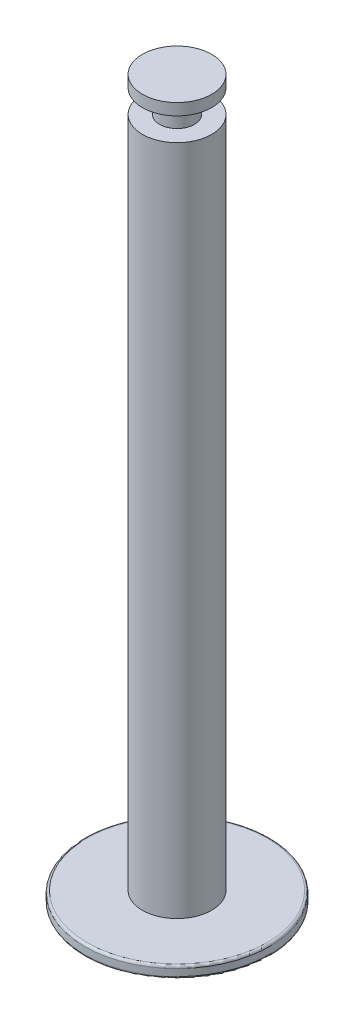
ISO-10303-21;
HEADER;
FILE_DESCRIPTION(('STEP AP214'),'2;1');
FILE_NAME('part.step','',(''),(''),'','','');
FILE_SCHEMA(('AUTOMOTIVE_DESIGN { 1 0 10303 214 1 1 1 1 }'));
ENDSEC;
DATA;
#1=APPLICATION_CONTEXT('core data for automotive mechanical design processes');
#2=APPLICATION_PROTOCOL_DEFINITION('international standard','automotive_design',2000,#1);
#3=PRODUCT_CONTEXT('',#1,'mechanical');
#4=PRODUCT('Part','Part','',(#3));
#5=PRODUCT_RELATED_PRODUCT_CATEGORY('part','',(#4));
#6=PRODUCT_DEFINITION_FORMATION('','',#4);
#7=PRODUCT_DEFINITION_CONTEXT('part definition',#1,'design');
#8=PRODUCT_DEFINITION('design','',#6,#7);
#9=PRODUCT_DEFINITION_SHAPE('','',#8);
#10=(LENGTH_UNIT() NAMED_UNIT(*) SI_UNIT(.MILLI.,.METRE.));
#11=(NAMED_UNIT(*) PLANE_ANGLE_UNIT() SI_UNIT($,.RADIAN.));
#12=(NAMED_UNIT(*) SI_UNIT($,.STERADIAN.) SOLID_ANGLE_UNIT());
#13=UNCERTAINTY_MEASURE_WITH_UNIT(LENGTH_MEASURE(1.E-05),#10,'distance_accuracy_value','');
#14=(GEOMETRIC_REPRESENTATION_CONTEXT(3) GLOBAL_UNCERTAINTY_ASSIGNED_CONTEXT((#13)) GLOBAL_UNIT_ASSIGNED_CONTEXT((#10,
#11,#12)) REPRESENTATION_CONTEXT('',''));
#15=CARTESIAN_POINT('',(0.,0.,0.));
#16=DIRECTION('',(0.,0.,1.));
#17=DIRECTION('',(1.,0.,0.));
#18=AXIS2_PLACEMENT_3D('',#15,#16,#17);
#19=CARTESIAN_POINT('',(0.,1.,0.));
#20=DIRECTION('',(0.,-1.,0.));
#21=DIRECTION('',(0.,0.,-1.));
#22=AXIS2_PLACEMENT_3D('',#19,#20,#21);
#23=CYLINDRICAL_SURFACE('',#22,7.99);
#24=CARTESIAN_POINT('',(0.,0.2,0.));
#25=DIRECTION('',(0.,1.,0.));
#26=DIRECTION('',(0.,0.,1.));
#27=AXIS2_PLACEMENT_3D('',#24,#25,#26);
#28=CIRCLE('',#27,7.99);
#29=CARTESIAN_POINT('',(0.,0.2,7.99));
#30=VERTEX_POINT('',#29);
#31=EDGE_CURVE('E64',#30,#30,#28,.T.);
#32=ORIENTED_EDGE('',*,*,#31,.T.);
#33=EDGE_LOOP('',(#32));
#34=FACE_BOUND('',#33,.T.);
#35=CARTESIAN_POINT('',(0.,0.8,0.));
#36=DIRECTION('',(0.,1.,0.));
#37=DIRECTION('',(0.,0.,1.));
#38=AXIS2_PLACEMENT_3D('',#35,#36,#37);
#39=CIRCLE('',#38,7.99);
#40=CARTESIAN_POINT('',(0.,0.8,7.99));
#41=VERTEX_POINT('',#40);
#42=EDGE_CURVE('E58',#41,#41,#39,.F.);
#43=ORIENTED_EDGE('',*,*,#42,.T.);
#44=EDGE_LOOP('',(#43));
#45=FACE_BOUND('',#44,.T.);
#46=ADVANCED_FACE('F38',(#34,#45),#23,.T.);
#47=CARTESIAN_POINT('',(0.,1.,0.));
#48=DIRECTION('',(0.,1.,0.));
#49=DIRECTION('',(0.,0.,1.));
#50=AXIS2_PLACEMENT_3D('',#47,#48,#49);
#51=PLANE('',#50);
#52=CARTESIAN_POINT('',(0.,1.,0.));
#53=DIRECTION('',(0.,1.,0.));
#54=DIRECTION('',(0.,0.,1.));
#55=AXIS2_PLACEMENT_3D('',#52,#53,#54);
#56=CIRCLE('',#55,2.99);
#57=CARTESIAN_POINT('',(0.,1.,-2.99));
#58=VERTEX_POINT('',#57);
#59=EDGE_CURVE('E59',#58,#58,#56,.T.);
#60=ORIENTED_EDGE('',*,*,#59,.F.);
#61=EDGE_LOOP('',(#60));
#62=FACE_BOUND('',#61,.T.);
#63=CARTESIAN_POINT('',(0.,1.,0.));
#64=DIRECTION('',(0.,1.,0.));
#65=DIRECTION('',(0.,0.,1.));
#66=AXIS2_PLACEMENT_3D('',#63,#64,#65);
#67=CIRCLE('',#66,7.79);
#68=CARTESIAN_POINT('',(0.,1.,7.79));
#69=VERTEX_POINT('',#68);
#70=EDGE_CURVE('E42',#69,#69,#67,.T.);
#71=ORIENTED_EDGE('',*,*,#70,.T.);
#72=EDGE_LOOP('',(#71));
#73=FACE_BOUND('',#72,.T.);
#74=ADVANCED_FACE('F78',(#62,#73),#51,.T.);
#75=CARTESIAN_POINT('',(0.,0.,0.));
#76=DIRECTION('',(0.,1.,0.));
#77=DIRECTION('',(0.,0.,1.));
#78=AXIS2_PLACEMENT_3D('',#75,#76,#77);
#79=PLANE('',#78);
#80=CARTESIAN_POINT('',(0.,0.,0.));
#81=DIRECTION('',(0.,1.,0.));
#82=DIRECTION('',(0.,0.,1.));
#83=AXIS2_PLACEMENT_3D('',#80,#81,#82);
#84=CIRCLE('',#83,7.79);
#85=CARTESIAN_POINT('',(0.,0.,7.79));
#86=VERTEX_POINT('',#85);
#87=EDGE_CURVE('E50',#86,#86,#84,.F.);
#88=ORIENTED_EDGE('',*,*,#87,.T.);
#89=EDGE_LOOP('',(#88));
#90=FACE_BOUND('',#89,.T.);
#91=ADVANCED_FACE('F69',(#90),#79,.F.);
#92=CARTESIAN_POINT('',(0.,0.2,0.));
#93=DIRECTION('',(0.,1.,0.));
#94=DIRECTION('',(0.,0.,1.));
#95=AXIS2_PLACEMENT_3D('',#92,#93,#94);
#96=TOROIDAL_SURFACE('',#95,7.79,0.2);
#97=ORIENTED_EDGE('',*,*,#87,.F.);
#98=EDGE_LOOP('',(#97));
#99=FACE_BOUND('',#98,.T.);
#100=ORIENTED_EDGE('',*,*,#31,.F.);
#101=EDGE_LOOP('',(#100));
#102=FACE_BOUND('',#101,.T.);
#103=ADVANCED_FACE('F71',(#99,#102),#96,.T.);
#104=CARTESIAN_POINT('',(0.,0.8,0.));
#105=DIRECTION('',(0.,1.,0.));
#106=DIRECTION('',(0.,0.,1.));
#107=AXIS2_PLACEMENT_3D('',#104,#105,#106);
#108=TOROIDAL_SURFACE('',#107,7.79,0.2);
#109=ORIENTED_EDGE('',*,*,#42,.F.);
#110=EDGE_LOOP('',(#109));
#111=FACE_BOUND('',#110,.T.);
#112=ORIENTED_EDGE('',*,*,#70,.F.);
#113=EDGE_LOOP('',(#112));
#114=FACE_BOUND('',#113,.T.);
#115=ADVANCED_FACE('F40',(#111,#114),#108,.T.);
#116=CARTESIAN_POINT('',(0.,59.,0.));
#117=DIRECTION('',(0.,-1.,0.));
#118=DIRECTION('',(0.,0.,-1.));
#119=AXIS2_PLACEMENT_3D('',#116,#117,#118);
#120=CYLINDRICAL_SURFACE('',#119,2.99);
#121=CARTESIAN_POINT('',(0.,59.,0.));
#122=DIRECTION('',(0.,1.,0.));
#123=DIRECTION('',(0.,0.,1.));
#124=AXIS2_PLACEMENT_3D('',#121,#122,#123);
#125=CIRCLE('',#124,2.99);
#126=CARTESIAN_POINT('',(0.,59.,-2.99));
#127=VERTEX_POINT('',#126);
#128=EDGE_CURVE('E55',#127,#127,#125,.T.);
#129=CARTESIAN_POINT('',(0.,59.,-2.99));
#130=CARTESIAN_POINT('',(0.,58.3958333333333,-2.99));
#131=CARTESIAN_POINT('',(0.,57.7916666666667,-2.99));
#132=CARTESIAN_POINT('',(0.,56.5833333333333,-2.99));
#133=CARTESIAN_POINT('',(0.,55.9791666666667,-2.99));
#134=CARTESIAN_POINT('',(0.,54.7708333333333,-2.99));
#135=CARTESIAN_POINT('',(0.,54.1666666666667,-2.99));
#136=CARTESIAN_POINT('',(0.,52.9583333333333,-2.99));
#137=CARTESIAN_POINT('',(0.,52.3541666666667,-2.99));
#138=CARTESIAN_POINT('',(0.,51.1458333333333,-2.99));
#139=CARTESIAN_POINT('',(0.,50.5416666666667,-2.99));
#140=CARTESIAN_POINT('',(0.,49.3333333333333,-2.99));
#141=CARTESIAN_POINT('',(0.,48.7291666666667,-2.99));
#142=CARTESIAN_POINT('',(0.,47.5208333333333,-2.99));
#143=CARTESIAN_POINT('',(0.,46.9166666666667,-2.99));
#144=CARTESIAN_POINT('',(0.,45.7083333333333,-2.99));
#145=CARTESIAN_POINT('',(0.,45.1041666666667,-2.99));
#146=CARTESIAN_POINT('',(0.,43.8958333333333,-2.99));
#147=CARTESIAN_POINT('',(0.,43.2916666666667,-2.99));
#148=CARTESIAN_POINT('',(0.,42.0833333333333,-2.99));
#149=CARTESIAN_POINT('',(0.,41.4791666666667,-2.99));
#150=CARTESIAN_POINT('',(0.,40.2708333333333,-2.99));
#151=CARTESIAN_POINT('',(0.,39.6666666666667,-2.99));
#152=CARTESIAN_POINT('',(0.,38.4583333333333,-2.99));
#153=CARTESIAN_POINT('',(0.,37.8541666666667,-2.99));
#154=CARTESIAN_POINT('',(0.,36.6458333333333,-2.99));
#155=CARTESIAN_POINT('',(0.,36.0416666666667,-2.99));
#156=CARTESIAN_POINT('',(0.,34.8333333333333,-2.99));
#157=CARTESIAN_POINT('',(0.,34.2291666666667,-2.99));
#158=CARTESIAN_POINT('',(0.,33.0208333333333,-2.99));
#159=CARTESIAN_POINT('',(0.,32.4166666666667,-2.99));
#160=CARTESIAN_POINT('',(0.,31.2083333333333,-2.99));
#161=CARTESIAN_POINT('',(0.,30.6041666666667,-2.99));
#162=CARTESIAN_POINT('',(0.,29.3958333333333,-2.99));
#163=CARTESIAN_POINT('',(0.,28.7916666666667,-2.99));
#164=CARTESIAN_POINT('',(0.,27.5833333333333,-2.99));
#165=CARTESIAN_POINT('',(0.,26.9791666666667,-2.99));
#166=CARTESIAN_POINT('',(0.,25.7708333333333,-2.99));
#167=CARTESIAN_POINT('',(0.,25.1666666666667,-2.99));
#168=CARTESIAN_POINT('',(0.,23.9583333333333,-2.99));
#169=CARTESIAN_POINT('',(0.,23.3541666666667,-2.99));
#170=CARTESIAN_POINT('',(0.,22.1458333333333,-2.99));
#171=CARTESIAN_POINT('',(0.,21.5416666666667,-2.99));
#172=CARTESIAN_POINT('',(0.,20.3333333333333,-2.99));
#173=CARTESIAN_POINT('',(0.,19.7291666666667,-2.99));
#174=CARTESIAN_POINT('',(0.,18.5208333333333,-2.99));
#175=CARTESIAN_POINT('',(0.,17.9166666666667,-2.99));
#176=CARTESIAN_POINT('',(0.,16.7083333333333,-2.99));
#177=CARTESIAN_POINT('',(0.,16.1041666666667,-2.99));
#178=CARTESIAN_POINT('',(0.,14.8958333333333,-2.99));
#179=CARTESIAN_POINT('',(0.,14.2916666666667,-2.99));
#180=CARTESIAN_POINT('',(0.,13.0833333333333,-2.99));
#181=CARTESIAN_POINT('',(0.,12.4791666666667,-2.99));
#182=CARTESIAN_POINT('',(0.,11.2708333333333,-2.99));
#183=CARTESIAN_POINT('',(0.,10.6666666666667,-2.99));
#184=CARTESIAN_POINT('',(0.,9.45833333333333,-2.99));
#185=CARTESIAN_POINT('',(0.,8.85416666666667,-2.99));
#186=CARTESIAN_POINT('',(0.,7.64583333333333,-2.99));
#187=CARTESIAN_POINT('',(0.,7.04166666666667,-2.99));
#188=CARTESIAN_POINT('',(0.,5.83333333333333,-2.99));
#189=CARTESIAN_POINT('',(0.,5.22916666666667,-2.99));
#190=CARTESIAN_POINT('',(0.,4.02083333333334,-2.99));
#191=CARTESIAN_POINT('',(0.,3.41666666666667,-2.99));
#192=CARTESIAN_POINT('',(0.,2.20833333333333,-2.99));
#193=CARTESIAN_POINT('',(0.,1.60416666666667,-2.99));
#194=CARTESIAN_POINT('',(0.,1.,-2.99));
#195=B_SPLINE_CURVE_WITH_KNOTS('',3,(#129,#130,#131,#132,#133,#134,#135,#136,#137,#138,#139,
#140,#141,#142,#143,#144,#145,#146,#147,#148,#149,#150,#151,#152,#153,#154,#155,#156,#157,#158,
#159,#160,#161,#162,#163,#164,#165,#166,#167,#168,#169,#170,#171,#172,#173,#174,#175,#176,#177,
#178,#179,#180,#181,#182,#183,#184,#185,#186,#187,#188,#189,#190,#191,#192,#193,#194),
.UNSPECIFIED.,.F.,.F.,(4,2,2,2,2,2,2,2,2,2,2,2,2,2,2,2,2,2,2,2,2,2,2,2,2,2,2,2,2,2,2,2,4),(0.,
1.81249999999999,3.625,5.4375,7.24999999999999,9.06249999999999,10.875,12.6875,14.5,16.3125,
18.125,19.9375,21.75,23.5625,25.375,27.1875,29.,30.8125,32.625,34.4375,36.25,38.0625,39.875,
41.6875,43.5,45.3125,47.125,48.9375,50.75,52.5625,54.375,56.1875,58.),.UNSPECIFIED.);
#196=EDGE_CURVE('BSEAM84',#127,#58,#195,.T.);
#197=ORIENTED_EDGE('',*,*,#128,.F.);
#198=ORIENTED_EDGE('',*,*,#59,.T.);
#199=ORIENTED_EDGE('',*,*,#196,.T.);
#200=ORIENTED_EDGE('',*,*,#196,.F.);
#201=EDGE_LOOP('',(#197,#199,#198,#200));
#202=FACE_BOUND('',#201,.T.);
#203=ADVANCED_FACE('F84',(#202),#120,.T.);
#204=CARTESIAN_POINT('',(0.,59.,0.));
#205=DIRECTION('',(0.,1.,0.));
#206=DIRECTION('',(0.,0.,1.));
#207=AXIS2_PLACEMENT_3D('',#204,#205,#206);
#208=PLANE('',#207);
#209=CARTESIAN_POINT('',(0.,59.,0.));
#210=DIRECTION('',(0.,1.,0.));
#211=DIRECTION('',(0.,0.,1.));
#212=AXIS2_PLACEMENT_3D('',#209,#210,#211);
#213=CIRCLE('',#212,1.5);
#214=CARTESIAN_POINT('',(0.,59.,1.5));
#215=VERTEX_POINT('',#214);
#216=EDGE_CURVE('E10',#215,#215,#213,.T.);
#217=ORIENTED_EDGE('',*,*,#216,.F.);
#218=EDGE_LOOP('',(#217));
#219=FACE_BOUND('',#218,.T.);
#220=ORIENTED_EDGE('',*,*,#128,.T.);
#221=EDGE_LOOP('',(#220));
#222=FACE_BOUND('',#221,.T.);
#223=ADVANCED_FACE('F98',(#219,#222),#208,.T.);
#224=CARTESIAN_POINT('',(0.,61.,0.));
#225=DIRECTION('',(0.,-1.,0.));
#226=DIRECTION('',(0.,0.,-1.));
#227=AXIS2_PLACEMENT_3D('',#224,#225,#226);
#228=CYLINDRICAL_SURFACE('',#227,1.5);
#229=CARTESIAN_POINT('',(0.,61.,0.));
#230=DIRECTION('',(0.,1.,0.));
#231=DIRECTION('',(0.,0.,1.));
#232=AXIS2_PLACEMENT_3D('',#229,#230,#231);
#233=CIRCLE('',#232,1.5);
#234=CARTESIAN_POINT('',(0.,61.,1.5));
#235=VERTEX_POINT('',#234);
#236=EDGE_CURVE('E53',#235,#235,#233,.T.);
#237=ORIENTED_EDGE('',*,*,#236,.F.);
#238=EDGE_LOOP('',(#237));
#239=FACE_BOUND('',#238,.T.);
#240=ORIENTED_EDGE('',*,*,#216,.T.);
#241=EDGE_LOOP('',(#240));
#242=FACE_BOUND('',#241,.T.);
#243=ADVANCED_FACE('F102',(#239,#242),#228,.T.);
#244=CARTESIAN_POINT('',(0.,62.,0.));
#245=DIRECTION('',(0.,-1.,0.));
#246=DIRECTION('',(0.,0.,-1.));
#247=AXIS2_PLACEMENT_3D('',#244,#245,#246);
#248=CYLINDRICAL_SURFACE('',#247,2.99);
#249=CARTESIAN_POINT('',(0.,62.,0.));
#250=DIRECTION('',(0.,1.,0.));
#251=DIRECTION('',(0.,0.,1.));
#252=AXIS2_PLACEMENT_3D('',#249,#250,#251);
#253=CIRCLE('',#252,2.99);
#254=CARTESIAN_POINT('',(0.,62.,2.99));
#255=VERTEX_POINT('',#254);
#256=EDGE_CURVE('E122',#255,#255,#253,.T.);
#257=ORIENTED_EDGE('',*,*,#256,.F.);
#258=EDGE_LOOP('',(#257));
#259=FACE_BOUND('',#258,.T.);
#260=CARTESIAN_POINT('',(0.,61.,0.));
#261=DIRECTION('',(0.,1.,0.));
#262=DIRECTION('',(0.,0.,1.));
#263=AXIS2_PLACEMENT_3D('',#260,#261,#262);
#264=CIRCLE('',#263,2.99);
#265=CARTESIAN_POINT('',(0.,61.,2.99));
#266=VERTEX_POINT('',#265);
#267=EDGE_CURVE('E123',#266,#266,#264,.T.);
#268=ORIENTED_EDGE('',*,*,#267,.T.);
#269=EDGE_LOOP('',(#268));
#270=FACE_BOUND('',#269,.T.);
#271=ADVANCED_FACE('F106',(#259,#270),#248,.T.);
#272=CARTESIAN_POINT('',(0.,62.,0.));
#273=DIRECTION('',(0.,1.,0.));
#274=DIRECTION('',(0.,0.,1.));
#275=AXIS2_PLACEMENT_3D('',#272,#273,#274);
#276=PLANE('',#275);
#277=ORIENTED_EDGE('',*,*,#256,.T.);
#278=EDGE_LOOP('',(#277));
#279=FACE_BOUND('',#278,.T.);
#280=ADVANCED_FACE('F110',(#279),#276,.T.);
#281=CARTESIAN_POINT('',(0.,61.,0.));
#282=DIRECTION('',(0.,1.,0.));
#283=DIRECTION('',(0.,0.,1.));
#284=AXIS2_PLACEMENT_3D('',#281,#282,#283);
#285=PLANE('',#284);
#286=ORIENTED_EDGE('',*,*,#236,.T.);
#287=EDGE_LOOP('',(#286));
#288=FACE_BOUND('',#287,.T.);
#289=ORIENTED_EDGE('',*,*,#267,.F.);
#290=EDGE_LOOP('',(#289));
#291=FACE_BOUND('',#290,.T.);
#292=ADVANCED_FACE('F112',(#288,#291),#285,.F.);
#293=CLOSED_SHELL('',(#46,#74,#91,#103,#115,#203,#223,#243,#271,#280,#292));
#294=MANIFOLD_SOLID_BREP('B2',#293);
#295=ADVANCED_BREP_SHAPE_REPRESENTATION('',(#18,#294),#14);
#296=SHAPE_DEFINITION_REPRESENTATION(#9,#295);
ENDSEC;
END-ISO-10303-21;
